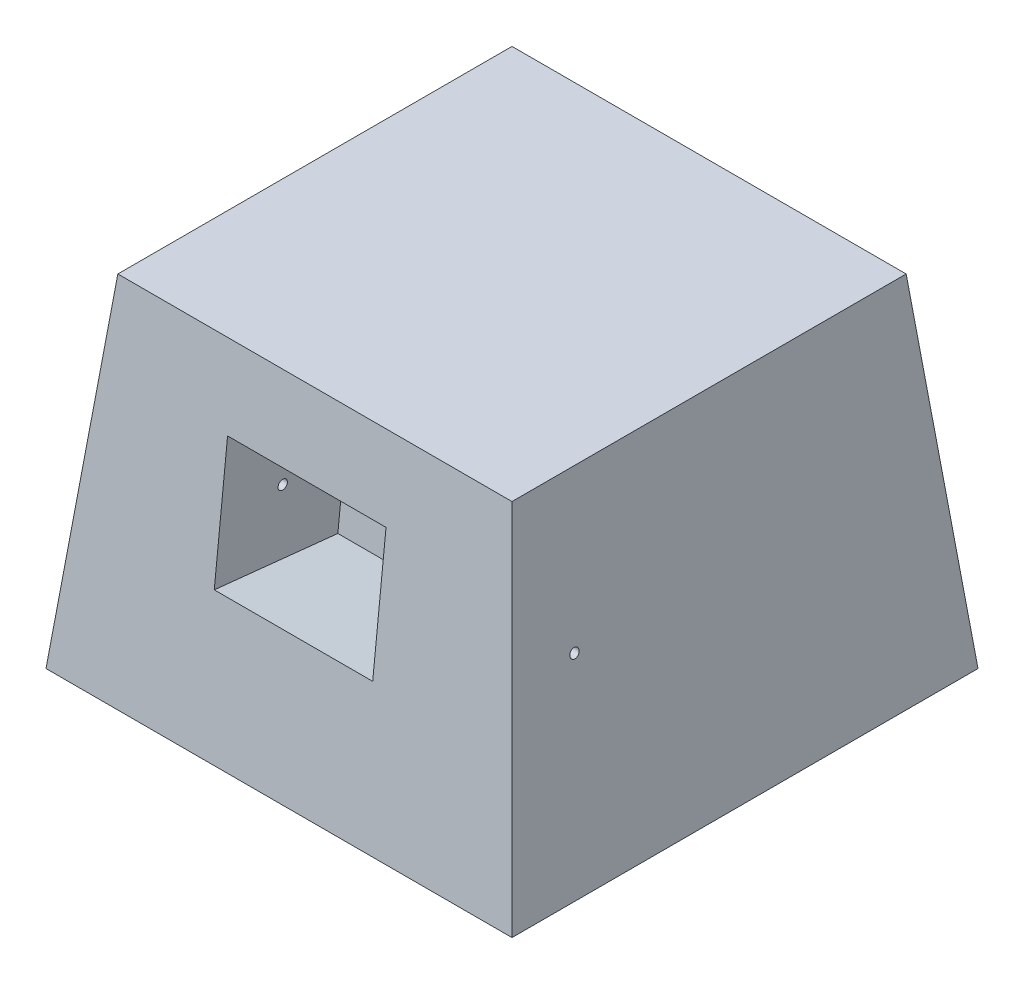
ISO-10303-21;
HEADER;
FILE_DESCRIPTION(('STEP AP214'),'2;1');
FILE_NAME('part.step','',(''),(''),'','','');
FILE_SCHEMA(('AUTOMOTIVE_DESIGN { 1 0 10303 214 1 1 1 1 }'));
ENDSEC;
DATA;
#1=APPLICATION_CONTEXT('core data for automotive mechanical design processes');
#2=APPLICATION_PROTOCOL_DEFINITION('international standard','automotive_design',2000,#1);
#3=PRODUCT_CONTEXT('',#1,'mechanical');
#4=PRODUCT('Part','Part','',(#3));
#5=PRODUCT_RELATED_PRODUCT_CATEGORY('part','',(#4));
#6=PRODUCT_DEFINITION_FORMATION('','',#4);
#7=PRODUCT_DEFINITION_CONTEXT('part definition',#1,'design');
#8=PRODUCT_DEFINITION('design','',#6,#7);
#9=PRODUCT_DEFINITION_SHAPE('','',#8);
#10=(LENGTH_UNIT() NAMED_UNIT(*) SI_UNIT(.MILLI.,.METRE.));
#11=(NAMED_UNIT(*) PLANE_ANGLE_UNIT() SI_UNIT($,.RADIAN.));
#12=(NAMED_UNIT(*) SI_UNIT($,.STERADIAN.) SOLID_ANGLE_UNIT());
#13=UNCERTAINTY_MEASURE_WITH_UNIT(LENGTH_MEASURE(1.E-05),#10,'distance_accuracy_value','');
#14=(GEOMETRIC_REPRESENTATION_CONTEXT(3) GLOBAL_UNCERTAINTY_ASSIGNED_CONTEXT((#13)) GLOBAL_UNIT_ASSIGNED_CONTEXT((#10,
#11,#12)) REPRESENTATION_CONTEXT('',''));
#15=CARTESIAN_POINT('',(0.,0.,0.));
#16=DIRECTION('',(0.,0.,1.));
#17=DIRECTION('',(1.,0.,0.));
#18=AXIS2_PLACEMENT_3D('',#15,#16,#17);
#19=CARTESIAN_POINT('',(-75.,0.,75.));
#20=DIRECTION('',(-0.994521895368273,0.104528463267654,0.));
#21=DIRECTION('',(-0.104528463267654,-0.994521895368273,0.));
#22=AXIS2_PLACEMENT_3D('',#19,#20,#21);
#23=PLANE('',#22);
#24=CARTESIAN_POINT('',(-68.4143068833587,62.6586844953905,48.3041412920884));
#25=DIRECTION('',(-0.994521895368273,0.104528463267654,0.));
#26=DIRECTION('',(0.104528463267654,0.994521895368274,0.));
#27=AXIS2_PLACEMENT_3D('',#24,#25,#26);
#28=ELLIPSE('',#27,1.50826241934528,1.5);
#29=CARTESIAN_POINT('',(-68.2566505304601,64.1586844953905,48.3041412920884));
#30=VERTEX_POINT('',#29);
#31=EDGE_CURVE('E135',#30,#30,#28,.T.);
#32=ORIENTED_EDGE('',*,*,#31,.F.);
#33=EDGE_LOOP('',(#32));
#34=FACE_BOUND('',#33,.T.);
#35=DIRECTION('',(0.,0.,-1.));
#36=VECTOR('',#35,1.);
#37=CARTESIAN_POINT('',(-75.,0.,75.));
#38=LINE('',#37,#36);
#39=CARTESIAN_POINT('',(-75.,0.,75.));
#40=VERTEX_POINT('',#39);
#41=CARTESIAN_POINT('',(-75.,0.,-75.));
#42=VERTEX_POINT('',#41);
#43=EDGE_CURVE('E147',#40,#42,#38,.T.);
#44=ORIENTED_EDGE('',*,*,#43,.F.);
#45=DIRECTION('',(0.103962051184498,0.989132844377854,-0.103962051184498));
#46=VECTOR('',#45,1.);
#47=CARTESIAN_POINT('',(-75.,0.,75.));
#48=LINE('',#47,#46);
#49=CARTESIAN_POINT('',(-63.4385341207756,110.,63.4385341207756));
#50=VERTEX_POINT('',#49);
#51=EDGE_CURVE('E11',#50,#40,#48,.F.);
#52=ORIENTED_EDGE('',*,*,#51,.F.);
#53=DIRECTION('',(0.,0.,-1.));
#54=VECTOR('',#53,1.);
#55=CARTESIAN_POINT('',(-63.4385341207756,110.,0.));
#56=LINE('',#55,#54);
#57=CARTESIAN_POINT('',(-63.4385341207756,110.,-63.4385341207756));
#58=VERTEX_POINT('',#57);
#59=EDGE_CURVE('E159',#50,#58,#56,.T.);
#60=ORIENTED_EDGE('',*,*,#59,.T.);
#61=DIRECTION('',(-0.103962051184498,-0.989132844377854,-0.103962051184498));
#62=VECTOR('',#61,1.);
#63=CARTESIAN_POINT('',(-73.3787837870268,15.4248419093217,-73.3787837870268));
#64=LINE('',#63,#62);
#65=EDGE_CURVE('E73',#58,#42,#64,.T.);
#66=ORIENTED_EDGE('',*,*,#65,.T.);
#67=EDGE_LOOP('',(#44,#52,#60,#66));
#68=FACE_BOUND('',#67,.T.);
#69=ADVANCED_FACE('F33',(#34,#68),#23,.T.);
#70=CARTESIAN_POINT('',(-75.,0.,75.));
#71=DIRECTION('',(0.,0.104528463267654,0.994521895368273));
#72=DIRECTION('',(0.,-0.994521895368273,0.104528463267654));
#73=AXIS2_PLACEMENT_3D('',#70,#71,#72);
#74=PLANE('',#73);
#75=DIRECTION('',(-1.,0.,0.));
#76=VECTOR('',#75,1.);
#77=CARTESIAN_POINT('',(-25.5,85.1369526157931,66.0517457024669));
#78=LINE('',#77,#76);
#79=CARTESIAN_POINT('',(25.5,85.1369526157931,66.0517457024669));
#80=VERTEX_POINT('',#79);
#81=CARTESIAN_POINT('',(-25.5,85.1369526157931,66.0517457024669));
#82=VERTEX_POINT('',#81);
#83=EDGE_CURVE('E141',#80,#82,#78,.T.);
#84=ORIENTED_EDGE('',*,*,#83,.F.);
#85=DIRECTION('',(0.,0.994521895368273,-0.104528463267654));
#86=VECTOR('',#85,1.);
#87=CARTESIAN_POINT('',(25.5,44.3615549056939,70.3374126964407));
#88=LINE('',#87,#86);
#89=CARTESIAN_POINT('',(25.5,44.3615549056939,70.3374126964407));
#90=VERTEX_POINT('',#89);
#91=EDGE_CURVE('E50',#90,#80,#88,.T.);
#92=ORIENTED_EDGE('',*,*,#91,.F.);
#93=DIRECTION('',(1.,0.,0.));
#94=VECTOR('',#93,1.);
#95=CARTESIAN_POINT('',(-25.5,44.3615549056939,70.3374126964407));
#96=LINE('',#95,#94);
#97=CARTESIAN_POINT('',(-25.5,44.3615549056939,70.3374126964407));
#98=VERTEX_POINT('',#97);
#99=EDGE_CURVE('E129',#98,#90,#96,.T.);
#100=ORIENTED_EDGE('',*,*,#99,.F.);
#101=DIRECTION('',(0.,-0.994521895368273,0.104528463267654));
#102=VECTOR('',#101,1.);
#103=CARTESIAN_POINT('',(-25.5,44.3615549056939,70.3374126964407));
#104=LINE('',#103,#102);
#105=EDGE_CURVE('E132',#82,#98,#104,.T.);
#106=ORIENTED_EDGE('',*,*,#105,.F.);
#107=EDGE_LOOP('',(#84,#92,#100,#106));
#108=FACE_BOUND('',#107,.T.);
#109=DIRECTION('',(1.,0.,0.));
#110=VECTOR('',#109,1.);
#111=CARTESIAN_POINT('',(-75.,0.,75.));
#112=LINE('',#111,#110);
#113=CARTESIAN_POINT('',(75.,0.,75.));
#114=VERTEX_POINT('',#113);
#115=EDGE_CURVE('E81',#40,#114,#112,.T.);
#116=ORIENTED_EDGE('',*,*,#115,.T.);
#117=DIRECTION('',(0.103962051184498,-0.989132844377854,0.103962051184498));
#118=VECTOR('',#117,1.);
#119=CARTESIAN_POINT('',(75.,0.,75.));
#120=LINE('',#119,#118);
#121=CARTESIAN_POINT('',(63.4385341207756,110.,63.4385341207756));
#122=VERTEX_POINT('',#121);
#123=EDGE_CURVE('E42',#122,#114,#120,.T.);
#124=ORIENTED_EDGE('',*,*,#123,.F.);
#125=DIRECTION('',(-1.,0.,0.));
#126=VECTOR('',#125,1.);
#127=CARTESIAN_POINT('',(0.,110.,63.4385341207756));
#128=LINE('',#127,#126);
#129=EDGE_CURVE('E163',#50,#122,#128,.F.);
#130=ORIENTED_EDGE('',*,*,#129,.F.);
#131=ORIENTED_EDGE('',*,*,#51,.T.);
#132=EDGE_LOOP('',(#116,#124,#130,#131));
#133=FACE_BOUND('',#132,.T.);
#134=ADVANCED_FACE('F35',(#108,#133),#74,.T.);
#135=CARTESIAN_POINT('',(75.,0.,75.));
#136=DIRECTION('',(0.994521895368273,0.104528463267654,0.));
#137=DIRECTION('',(-0.104528463267654,0.994521895368273,0.));
#138=AXIS2_PLACEMENT_3D('',#135,#136,#137);
#139=PLANE('',#138);
#140=CARTESIAN_POINT('',(68.4143068833587,62.6586844953905,48.3041412920884));
#141=DIRECTION('',(0.994521895368273,0.104528463267654,0.));
#142=DIRECTION('',(0.104528463267654,-0.994521895368274,0.));
#143=AXIS2_PLACEMENT_3D('',#140,#141,#142);
#144=ELLIPSE('',#143,1.50826241934528,1.5);
#145=CARTESIAN_POINT('',(68.5719632362572,61.1586844953905,48.3041412920884));
#146=VERTEX_POINT('',#145);
#147=EDGE_CURVE('E273',#146,#146,#144,.F.);
#148=ORIENTED_EDGE('',*,*,#147,.T.);
#149=EDGE_LOOP('',(#148));
#150=FACE_BOUND('',#149,.T.);
#151=DIRECTION('',(0.,0.,-1.));
#152=VECTOR('',#151,1.);
#153=CARTESIAN_POINT('',(75.,0.,75.));
#154=LINE('',#153,#152);
#155=CARTESIAN_POINT('',(75.,0.,-75.));
#156=VERTEX_POINT('',#155);
#157=EDGE_CURVE('E156',#114,#156,#154,.T.);
#158=ORIENTED_EDGE('',*,*,#157,.T.);
#159=DIRECTION('',(-0.103962051184498,0.989132844377854,0.103962051184498));
#160=VECTOR('',#159,1.);
#161=CARTESIAN_POINT('',(73.3787837870268,15.4248419093217,-73.3787837870268));
#162=LINE('',#161,#160);
#163=CARTESIAN_POINT('',(63.4385341207756,110.,-63.4385341207756));
#164=VERTEX_POINT('',#163);
#165=EDGE_CURVE('E162',#164,#156,#162,.F.);
#166=ORIENTED_EDGE('',*,*,#165,.F.);
#167=DIRECTION('',(0.,0.,1.));
#168=VECTOR('',#167,1.);
#169=CARTESIAN_POINT('',(63.4385341207756,110.,0.));
#170=LINE('',#169,#168);
#171=EDGE_CURVE('E169',#122,#164,#170,.F.);
#172=ORIENTED_EDGE('',*,*,#171,.F.);
#173=ORIENTED_EDGE('',*,*,#123,.T.);
#174=EDGE_LOOP('',(#158,#166,#172,#173));
#175=FACE_BOUND('',#174,.T.);
#176=ADVANCED_FACE('F180',(#150,#175),#139,.T.);
#177=CARTESIAN_POINT('',(-75.,0.,-75.));
#178=DIRECTION('',(0.,0.104528463267654,-0.994521895368273));
#179=DIRECTION('',(0.,0.994521895368273,0.104528463267654));
#180=AXIS2_PLACEMENT_3D('',#177,#178,#179);
#181=PLANE('',#180);
#182=DIRECTION('',(1.,0.,0.));
#183=VECTOR('',#182,1.);
#184=CARTESIAN_POINT('',(-75.,0.,-75.));
#185=LINE('',#184,#183);
#186=EDGE_CURVE('E153',#42,#156,#185,.T.);
#187=ORIENTED_EDGE('',*,*,#186,.F.);
#188=ORIENTED_EDGE('',*,*,#65,.F.);
#189=DIRECTION('',(1.,0.,0.));
#190=VECTOR('',#189,1.);
#191=CARTESIAN_POINT('',(0.,110.,-63.4385341207756));
#192=LINE('',#191,#190);
#193=EDGE_CURVE('E167',#58,#164,#192,.T.);
#194=ORIENTED_EDGE('',*,*,#193,.T.);
#195=ORIENTED_EDGE('',*,*,#165,.T.);
#196=EDGE_LOOP('',(#187,#188,#194,#195));
#197=FACE_BOUND('',#196,.T.);
#198=ADVANCED_FACE('F170',(#197),#181,.T.);
#199=CARTESIAN_POINT('',(0.,110.,0.));
#200=DIRECTION('',(0.,-1.,0.));
#201=DIRECTION('',(0.,0.,-1.));
#202=AXIS2_PLACEMENT_3D('',#199,#200,#201);
#203=PLANE('',#202);
#204=ORIENTED_EDGE('',*,*,#59,.F.);
#205=ORIENTED_EDGE('',*,*,#129,.T.);
#206=ORIENTED_EDGE('',*,*,#171,.T.);
#207=ORIENTED_EDGE('',*,*,#193,.F.);
#208=EDGE_LOOP('',(#204,#205,#206,#207));
#209=FACE_BOUND('',#208,.T.);
#210=ADVANCED_FACE('F174',(#209),#203,.F.);
#211=CARTESIAN_POINT('',(0.,0.,0.));
#212=DIRECTION('',(0.,-1.,0.));
#213=DIRECTION('',(0.,0.,-1.));
#214=AXIS2_PLACEMENT_3D('',#211,#212,#213);
#215=PLANE('',#214);
#216=ORIENTED_EDGE('',*,*,#43,.T.);
#217=ORIENTED_EDGE('',*,*,#186,.T.);
#218=ORIENTED_EDGE('',*,*,#157,.F.);
#219=ORIENTED_EDGE('',*,*,#115,.F.);
#220=EDGE_LOOP('',(#216,#217,#218,#219));
#221=FACE_BOUND('',#220,.T.);
#222=ADVANCED_FACE('F178',(#221),#215,.T.);
#223=CARTESIAN_POINT('',(25.5,40.1804163749878,30.5565368817098));
#224=DIRECTION('',(1.,0.,0.));
#225=DIRECTION('',(0.,0.,-1.));
#226=AXIS2_PLACEMENT_3D('',#223,#224,#225);
#227=PLANE('',#226);
#228=CARTESIAN_POINT('',(25.5,62.6586844953905,48.3041412920884));
#229=DIRECTION('',(1.,0.,0.));
#230=DIRECTION('',(0.,0.,-1.));
#231=AXIS2_PLACEMENT_3D('',#228,#229,#230);
#232=CIRCLE('',#231,1.5);
#233=CARTESIAN_POINT('',(25.5,62.6586844953905,46.8041412920884));
#234=VERTEX_POINT('',#233);
#235=EDGE_CURVE('E270',#234,#234,#232,.T.);
#236=ORIENTED_EDGE('',*,*,#235,.T.);
#237=EDGE_LOOP('',(#236));
#238=FACE_BOUND('',#237,.T.);
#239=ORIENTED_EDGE('',*,*,#91,.T.);
#240=DIRECTION('',(0.,0.104528463267654,0.994521895368273));
#241=VECTOR('',#240,1.);
#242=CARTESIAN_POINT('',(25.5,80.955814085087,26.270869887736));
#243=LINE('',#242,#241);
#244=CARTESIAN_POINT('',(25.5,80.955814085087,26.270869887736));
#245=VERTEX_POINT('',#244);
#246=EDGE_CURVE('E107',#245,#80,#243,.T.);
#247=ORIENTED_EDGE('',*,*,#246,.F.);
#248=DIRECTION('',(0.,0.994521895368273,-0.104528463267654));
#249=VECTOR('',#248,1.);
#250=CARTESIAN_POINT('',(25.5,40.1804163749878,30.5565368817098));
#251=LINE('',#250,#249);
#252=CARTESIAN_POINT('',(25.5,40.1804163749878,30.5565368817098));
#253=VERTEX_POINT('',#252);
#254=EDGE_CURVE('E111',#253,#245,#251,.T.);
#255=ORIENTED_EDGE('',*,*,#254,.F.);
#256=DIRECTION('',(0.,0.104528463267654,0.994521895368273));
#257=VECTOR('',#256,1.);
#258=CARTESIAN_POINT('',(25.5,40.1804163749878,30.5565368817098));
#259=LINE('',#258,#257);
#260=EDGE_CURVE('E145',#253,#90,#259,.T.);
#261=ORIENTED_EDGE('',*,*,#260,.T.);
#262=EDGE_LOOP('',(#239,#247,#255,#261));
#263=FACE_BOUND('',#262,.T.);
#264=ADVANCED_FACE('F109',(#238,#263),#227,.F.);
#265=CARTESIAN_POINT('',(-25.5,40.1804163749878,30.5565368817098));
#266=DIRECTION('',(0.,-0.994521895368273,0.104528463267654));
#267=DIRECTION('',(0.,-0.104528463267654,-0.994521895368273));
#268=AXIS2_PLACEMENT_3D('',#265,#266,#267);
#269=PLANE('',#268);
#270=ORIENTED_EDGE('',*,*,#99,.T.);
#271=ORIENTED_EDGE('',*,*,#260,.F.);
#272=DIRECTION('',(1.,0.,0.));
#273=VECTOR('',#272,1.);
#274=CARTESIAN_POINT('',(-25.5,40.1804163749878,30.5565368817098));
#275=LINE('',#274,#273);
#276=CARTESIAN_POINT('',(-25.5,40.1804163749878,30.5565368817098));
#277=VERTEX_POINT('',#276);
#278=EDGE_CURVE('E117',#277,#253,#275,.T.);
#279=ORIENTED_EDGE('',*,*,#278,.F.);
#280=DIRECTION('',(0.,0.104528463267654,0.994521895368273));
#281=VECTOR('',#280,1.);
#282=CARTESIAN_POINT('',(-25.5,40.1804163749878,30.5565368817098));
#283=LINE('',#282,#281);
#284=EDGE_CURVE('E148',#277,#98,#283,.T.);
#285=ORIENTED_EDGE('',*,*,#284,.T.);
#286=EDGE_LOOP('',(#270,#271,#279,#285));
#287=FACE_BOUND('',#286,.T.);
#288=ADVANCED_FACE('F195',(#287),#269,.F.);
#289=CARTESIAN_POINT('',(-25.5,40.1804163749878,30.5565368817098));
#290=DIRECTION('',(-1.,0.,0.));
#291=DIRECTION('',(0.,0.,1.));
#292=AXIS2_PLACEMENT_3D('',#289,#290,#291);
#293=PLANE('',#292);
#294=CARTESIAN_POINT('',(-25.5,62.6586844953905,48.3041412920884));
#295=DIRECTION('',(-1.,0.,0.));
#296=DIRECTION('',(0.,0.,1.));
#297=AXIS2_PLACEMENT_3D('',#294,#295,#296);
#298=CIRCLE('',#297,1.5);
#299=CARTESIAN_POINT('',(-25.5,62.6586844953905,49.8041412920884));
#300=VERTEX_POINT('',#299);
#301=EDGE_CURVE('E37',#300,#300,#298,.T.);
#302=ORIENTED_EDGE('',*,*,#301,.T.);
#303=EDGE_LOOP('',(#302));
#304=FACE_BOUND('',#303,.T.);
#305=ORIENTED_EDGE('',*,*,#105,.T.);
#306=ORIENTED_EDGE('',*,*,#284,.F.);
#307=DIRECTION('',(0.,-0.994521895368273,0.104528463267654));
#308=VECTOR('',#307,1.);
#309=CARTESIAN_POINT('',(-25.5,40.1804163749878,30.5565368817098));
#310=LINE('',#309,#308);
#311=CARTESIAN_POINT('',(-25.5,80.955814085087,26.270869887736));
#312=VERTEX_POINT('',#311);
#313=EDGE_CURVE('E125',#312,#277,#310,.T.);
#314=ORIENTED_EDGE('',*,*,#313,.F.);
#315=DIRECTION('',(0.,0.104528463267654,0.994521895368273));
#316=VECTOR('',#315,1.);
#317=CARTESIAN_POINT('',(-25.5,80.955814085087,26.270869887736));
#318=LINE('',#317,#316);
#319=EDGE_CURVE('E116',#312,#82,#318,.T.);
#320=ORIENTED_EDGE('',*,*,#319,.T.);
#321=EDGE_LOOP('',(#305,#306,#314,#320));
#322=FACE_BOUND('',#321,.T.);
#323=ADVANCED_FACE('F193',(#304,#322),#293,.F.);
#324=CARTESIAN_POINT('',(-25.5,80.955814085087,26.270869887736));
#325=DIRECTION('',(0.,0.994521895368273,-0.104528463267654));
#326=DIRECTION('',(0.,0.104528463267654,0.994521895368273));
#327=AXIS2_PLACEMENT_3D('',#324,#325,#326);
#328=PLANE('',#327);
#329=ORIENTED_EDGE('',*,*,#83,.T.);
#330=ORIENTED_EDGE('',*,*,#319,.F.);
#331=DIRECTION('',(-1.,0.,0.));
#332=VECTOR('',#331,1.);
#333=CARTESIAN_POINT('',(-25.5,80.955814085087,26.270869887736));
#334=LINE('',#333,#332);
#335=EDGE_CURVE('E120',#245,#312,#334,.T.);
#336=ORIENTED_EDGE('',*,*,#335,.F.);
#337=ORIENTED_EDGE('',*,*,#246,.T.);
#338=EDGE_LOOP('',(#329,#330,#336,#337));
#339=FACE_BOUND('',#338,.T.);
#340=ADVANCED_FACE('F121',(#339),#328,.F.);
#341=CARTESIAN_POINT('',(0.,3.61554987495985,34.3996592127868));
#342=DIRECTION('',(0.,-0.104528463267654,-0.994521895368273));
#343=DIRECTION('',(0.,0.994521895368273,-0.104528463267654));
#344=AXIS2_PLACEMENT_3D('',#341,#342,#343);
#345=PLANE('',#344);
#346=ORIENTED_EDGE('',*,*,#254,.T.);
#347=ORIENTED_EDGE('',*,*,#335,.T.);
#348=ORIENTED_EDGE('',*,*,#313,.T.);
#349=ORIENTED_EDGE('',*,*,#278,.T.);
#350=EDGE_LOOP('',(#346,#347,#348,#349));
#351=FACE_BOUND('',#350,.T.);
#352=ADVANCED_FACE('F127',(#351),#345,.F.);
#353=CARTESIAN_POINT('',(-75.,62.6586844953905,48.3041412920884));
#354=DIRECTION('',(1.,0.,0.));
#355=DIRECTION('',(0.,0.,-1.));
#356=AXIS2_PLACEMENT_3D('',#353,#354,#355);
#357=CYLINDRICAL_SURFACE('',#356,1.5);
#358=ORIENTED_EDGE('',*,*,#31,.T.);
#359=EDGE_LOOP('',(#358));
#360=FACE_BOUND('',#359,.T.);
#361=ORIENTED_EDGE('',*,*,#301,.F.);
#362=EDGE_LOOP('',(#361));
#363=FACE_BOUND('',#362,.T.);
#364=ADVANCED_FACE('F248',(#360,#363),#357,.F.);
#365=ORIENTED_EDGE('',*,*,#235,.F.);
#366=EDGE_LOOP('',(#365));
#367=FACE_BOUND('',#366,.T.);
#368=ORIENTED_EDGE('',*,*,#147,.F.);
#369=EDGE_LOOP('',(#368));
#370=FACE_BOUND('',#369,.T.);
#371=ADVANCED_FACE('F253',(#367,#370),#357,.F.);
#372=CLOSED_SHELL('',(#69,#134,#176,#198,#210,#222,#264,#288,#323,#340,#352,#364,#371));
#373=MANIFOLD_SOLID_BREP('B2',#372);
#374=ADVANCED_BREP_SHAPE_REPRESENTATION('',(#18,#373),#14);
#375=SHAPE_DEFINITION_REPRESENTATION(#9,#374);
ENDSEC;
END-ISO-10303-21;
